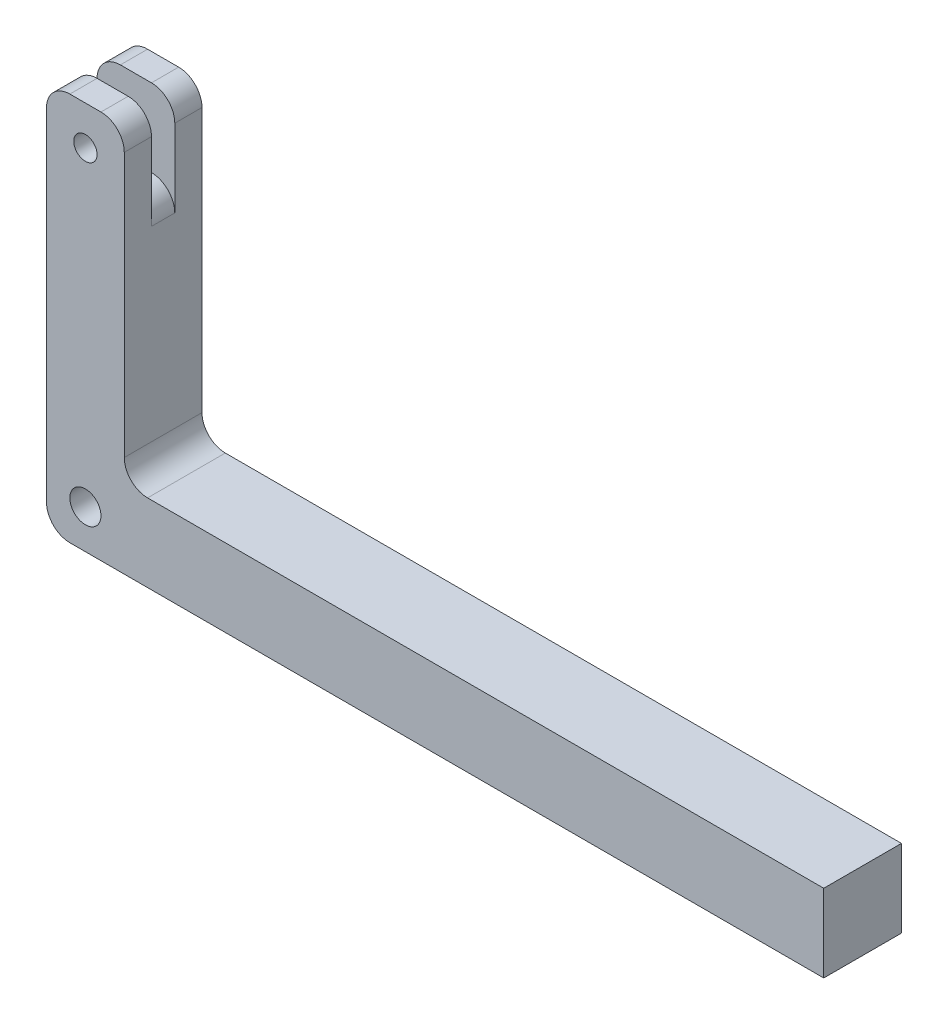
ISO-10303-21;
HEADER;
FILE_DESCRIPTION(('STEP AP214'),'2;1');
FILE_NAME('part.step','',(''),(''),'','','');
FILE_SCHEMA(('AUTOMOTIVE_DESIGN { 1 0 10303 214 1 1 1 1 }'));
ENDSEC;
DATA;
#1=APPLICATION_CONTEXT('core data for automotive mechanical design processes');
#2=APPLICATION_PROTOCOL_DEFINITION('international standard','automotive_design',2000,#1);
#3=PRODUCT_CONTEXT('',#1,'mechanical');
#4=PRODUCT('Part','Part','',(#3));
#5=PRODUCT_RELATED_PRODUCT_CATEGORY('part','',(#4));
#6=PRODUCT_DEFINITION_FORMATION('','',#4);
#7=PRODUCT_DEFINITION_CONTEXT('part definition',#1,'design');
#8=PRODUCT_DEFINITION('design','',#6,#7);
#9=PRODUCT_DEFINITION_SHAPE('','',#8);
#10=(LENGTH_UNIT() NAMED_UNIT(*) SI_UNIT(.MILLI.,.METRE.));
#11=(NAMED_UNIT(*) PLANE_ANGLE_UNIT() SI_UNIT($,.RADIAN.));
#12=(NAMED_UNIT(*) SI_UNIT($,.STERADIAN.) SOLID_ANGLE_UNIT());
#13=UNCERTAINTY_MEASURE_WITH_UNIT(LENGTH_MEASURE(1.E-05),#10,'distance_accuracy_value','');
#14=(GEOMETRIC_REPRESENTATION_CONTEXT(3) GLOBAL_UNCERTAINTY_ASSIGNED_CONTEXT((#13)) GLOBAL_UNIT_ASSIGNED_CONTEXT((#10,
#11,#12)) REPRESENTATION_CONTEXT('',''));
#15=CARTESIAN_POINT('',(0.,0.,0.));
#16=DIRECTION('',(0.,0.,1.));
#17=DIRECTION('',(1.,0.,0.));
#18=AXIS2_PLACEMENT_3D('',#15,#16,#17);
#19=CARTESIAN_POINT('',(0.,0.,0.));
#20=DIRECTION('',(0.,0.,1.));
#21=DIRECTION('',(1.,0.,0.));
#22=AXIS2_PLACEMENT_3D('',#19,#20,#21);
#23=PLANE('',#22);
#24=DIRECTION('',(1.,0.,0.));
#25=VECTOR('',#24,1.);
#26=CARTESIAN_POINT('',(0.,0.,0.));
#27=LINE('',#26,#25);
#28=CARTESIAN_POINT('',(3.,0.,0.));
#29=VERTEX_POINT('',#28);
#30=CARTESIAN_POINT('',(100.,0.,0.));
#31=VERTEX_POINT('',#30);
#32=EDGE_CURVE('E178',#29,#31,#27,.T.);
#33=ORIENTED_EDGE('',*,*,#32,.F.);
#34=CARTESIAN_POINT('',(3.,3.,0.));
#35=DIRECTION('',(0.,0.,1.));
#36=DIRECTION('',(1.,0.,0.));
#37=AXIS2_PLACEMENT_3D('',#34,#35,#36);
#38=CIRCLE('',#37,3.);
#39=CARTESIAN_POINT('',(0.,3.,0.));
#40=VERTEX_POINT('',#39);
#41=EDGE_CURVE('E232',#29,#40,#38,.F.);
#42=ORIENTED_EDGE('',*,*,#41,.T.);
#43=DIRECTION('',(0.,-1.,0.));
#44=VECTOR('',#43,1.);
#45=CARTESIAN_POINT('',(0.,50.,0.));
#46=LINE('',#45,#44);
#47=CARTESIAN_POINT('',(0.,47.,0.));
#48=VERTEX_POINT('',#47);
#49=EDGE_CURVE('E198',#48,#40,#46,.T.);
#50=ORIENTED_EDGE('',*,*,#49,.F.);
#51=CARTESIAN_POINT('',(3.,47.,0.));
#52=DIRECTION('',(0.,0.,1.));
#53=DIRECTION('',(1.,0.,0.));
#54=AXIS2_PLACEMENT_3D('',#51,#52,#53);
#55=CIRCLE('',#54,3.);
#56=CARTESIAN_POINT('',(3.,50.,0.));
#57=VERTEX_POINT('',#56);
#58=EDGE_CURVE('E228',#48,#57,#55,.F.);
#59=ORIENTED_EDGE('',*,*,#58,.T.);
#60=DIRECTION('',(-1.,0.,0.));
#61=VECTOR('',#60,1.);
#62=CARTESIAN_POINT('',(10.,50.,0.));
#63=LINE('',#62,#61);
#64=CARTESIAN_POINT('',(7.,50.,0.));
#65=VERTEX_POINT('',#64);
#66=EDGE_CURVE('E211',#65,#57,#63,.T.);
#67=ORIENTED_EDGE('',*,*,#66,.F.);
#68=CARTESIAN_POINT('',(7.,47.,0.));
#69=DIRECTION('',(0.,0.,1.));
#70=DIRECTION('',(1.,0.,0.));
#71=AXIS2_PLACEMENT_3D('',#68,#69,#70);
#72=CIRCLE('',#71,3.);
#73=CARTESIAN_POINT('',(10.,47.,0.));
#74=VERTEX_POINT('',#73);
#75=EDGE_CURVE('E230',#65,#74,#72,.F.);
#76=ORIENTED_EDGE('',*,*,#75,.T.);
#77=DIRECTION('',(0.,1.,0.));
#78=VECTOR('',#77,1.);
#79=CARTESIAN_POINT('',(9.99999999999999,9.99999999999999,0.));
#80=LINE('',#79,#78);
#81=CARTESIAN_POINT('',(9.99999999999999,13.,0.));
#82=VERTEX_POINT('',#81);
#83=EDGE_CURVE('E208',#82,#74,#80,.T.);
#84=ORIENTED_EDGE('',*,*,#83,.F.);
#85=CARTESIAN_POINT('',(13.,13.,0.));
#86=DIRECTION('',(0.,0.,1.));
#87=DIRECTION('',(1.,0.,0.));
#88=AXIS2_PLACEMENT_3D('',#85,#86,#87);
#89=CIRCLE('',#88,3.);
#90=CARTESIAN_POINT('',(13.,9.99999999999999,0.));
#91=VERTEX_POINT('',#90);
#92=EDGE_CURVE('E271',#82,#91,#89,.T.);
#93=ORIENTED_EDGE('',*,*,#92,.T.);
#94=DIRECTION('',(-1.,0.,0.));
#95=VECTOR('',#94,1.);
#96=CARTESIAN_POINT('',(100.,10.,0.));
#97=LINE('',#96,#95);
#98=CARTESIAN_POINT('',(100.,10.,0.));
#99=VERTEX_POINT('',#98);
#100=EDGE_CURVE('E205',#99,#91,#97,.T.);
#101=ORIENTED_EDGE('',*,*,#100,.F.);
#102=DIRECTION('',(0.,1.,0.));
#103=VECTOR('',#102,1.);
#104=CARTESIAN_POINT('',(100.,0.,0.));
#105=LINE('',#104,#103);
#106=EDGE_CURVE('E203',#31,#99,#105,.T.);
#107=ORIENTED_EDGE('',*,*,#106,.F.);
#108=EDGE_LOOP('',(#33,#42,#50,#59,#67,#76,#84,#93,#101,#107));
#109=FACE_BOUND('',#108,.T.);
#110=CARTESIAN_POINT('',(5.,5.,0.));
#111=DIRECTION('',(0.,0.,1.));
#112=DIRECTION('',(1.,0.,0.));
#113=AXIS2_PLACEMENT_3D('',#110,#111,#112);
#114=CIRCLE('',#113,2.);
#115=CARTESIAN_POINT('',(7.,5.,0.));
#116=VERTEX_POINT('',#115);
#117=EDGE_CURVE('E309',#116,#116,#114,.T.);
#118=ORIENTED_EDGE('',*,*,#117,.T.);
#119=EDGE_LOOP('',(#118));
#120=FACE_BOUND('',#119,.T.);
#121=CARTESIAN_POINT('',(5.,45.,0.));
#122=DIRECTION('',(0.,0.,-1.));
#123=DIRECTION('',(-1.,0.,0.));
#124=AXIS2_PLACEMENT_3D('',#121,#122,#123);
#125=CIRCLE('',#124,1.5);
#126=CARTESIAN_POINT('',(3.5,45.,0.));
#127=VERTEX_POINT('',#126);
#128=EDGE_CURVE('E562',#127,#127,#125,.T.);
#129=ORIENTED_EDGE('',*,*,#128,.F.);
#130=EDGE_LOOP('',(#129));
#131=FACE_BOUND('',#130,.T.);
#132=ADVANCED_FACE('F33',(#109,#120,#131),#23,.F.);
#133=CARTESIAN_POINT('',(10.,50.,10.));
#134=DIRECTION('',(0.,-1.,0.));
#135=DIRECTION('',(0.,0.,-1.));
#136=AXIS2_PLACEMENT_3D('',#133,#134,#135);
#137=PLANE('',#136);
#138=DIRECTION('',(-1.,0.,0.));
#139=VECTOR('',#138,1.);
#140=CARTESIAN_POINT('',(0.,50.,3.5));
#141=LINE('',#140,#139);
#142=CARTESIAN_POINT('',(7.,50.,3.5));
#143=VERTEX_POINT('',#142);
#144=CARTESIAN_POINT('',(3.,50.,3.5));
#145=VERTEX_POINT('',#144);
#146=EDGE_CURVE('E341',#143,#145,#141,.T.);
#147=ORIENTED_EDGE('',*,*,#146,.F.);
#148=DIRECTION('',(0.,0.,-1.));
#149=VECTOR('',#148,1.);
#150=CARTESIAN_POINT('',(7.,50.,10.));
#151=LINE('',#150,#149);
#152=EDGE_CURVE('E258',#143,#65,#151,.T.);
#153=ORIENTED_EDGE('',*,*,#152,.T.);
#154=ORIENTED_EDGE('',*,*,#66,.T.);
#155=DIRECTION('',(0.,0.,-1.));
#156=VECTOR('',#155,1.);
#157=CARTESIAN_POINT('',(3.,50.,10.));
#158=LINE('',#157,#156);
#159=EDGE_CURVE('E256',#57,#145,#158,.F.);
#160=ORIENTED_EDGE('',*,*,#159,.T.);
#161=EDGE_LOOP('',(#147,#153,#154,#160));
#162=FACE_BOUND('',#161,.T.);
#163=ADVANCED_FACE('F338',(#162),#137,.F.);
#164=CARTESIAN_POINT('',(0.,0.,10.));
#165=DIRECTION('',(0.,0.,1.));
#166=DIRECTION('',(1.,0.,0.));
#167=AXIS2_PLACEMENT_3D('',#164,#165,#166);
#168=PLANE('',#167);
#169=CARTESIAN_POINT('',(5.,45.,10.));
#170=DIRECTION('',(0.,0.,1.));
#171=DIRECTION('',(1.,0.,0.));
#172=AXIS2_PLACEMENT_3D('',#169,#170,#171);
#173=CIRCLE('',#172,1.5);
#174=CARTESIAN_POINT('',(6.5,45.,10.));
#175=VERTEX_POINT('',#174);
#176=EDGE_CURVE('E560',#175,#175,#173,.F.);
#177=ORIENTED_EDGE('',*,*,#176,.T.);
#178=EDGE_LOOP('',(#177));
#179=FACE_BOUND('',#178,.T.);
#180=DIRECTION('',(0.,-1.,0.));
#181=VECTOR('',#180,1.);
#182=CARTESIAN_POINT('',(0.,50.,10.));
#183=LINE('',#182,#181);
#184=CARTESIAN_POINT('',(0.,47.,10.));
#185=VERTEX_POINT('',#184);
#186=CARTESIAN_POINT('',(0.,3.,10.));
#187=VERTEX_POINT('',#186);
#188=EDGE_CURVE('E172',#185,#187,#183,.T.);
#189=ORIENTED_EDGE('',*,*,#188,.T.);
#190=CARTESIAN_POINT('',(3.,3.,10.));
#191=DIRECTION('',(0.,0.,1.));
#192=DIRECTION('',(1.,0.,0.));
#193=AXIS2_PLACEMENT_3D('',#190,#191,#192);
#194=CIRCLE('',#193,3.);
#195=CARTESIAN_POINT('',(3.,0.,10.));
#196=VERTEX_POINT('',#195);
#197=EDGE_CURVE('E168',#187,#196,#194,.T.);
#198=ORIENTED_EDGE('',*,*,#197,.T.);
#199=DIRECTION('',(1.,0.,0.));
#200=VECTOR('',#199,1.);
#201=CARTESIAN_POINT('',(0.,0.,10.));
#202=LINE('',#201,#200);
#203=CARTESIAN_POINT('',(100.,0.,10.));
#204=VERTEX_POINT('',#203);
#205=EDGE_CURVE('E158',#196,#204,#202,.T.);
#206=ORIENTED_EDGE('',*,*,#205,.T.);
#207=DIRECTION('',(0.,1.,0.));
#208=VECTOR('',#207,1.);
#209=CARTESIAN_POINT('',(100.,0.,10.));
#210=LINE('',#209,#208);
#211=CARTESIAN_POINT('',(100.,10.,10.));
#212=VERTEX_POINT('',#211);
#213=EDGE_CURVE('E165',#204,#212,#210,.T.);
#214=ORIENTED_EDGE('',*,*,#213,.T.);
#215=DIRECTION('',(-1.,0.,0.));
#216=VECTOR('',#215,1.);
#217=CARTESIAN_POINT('',(100.,10.,10.));
#218=LINE('',#217,#216);
#219=CARTESIAN_POINT('',(13.,9.99999999999999,10.));
#220=VERTEX_POINT('',#219);
#221=EDGE_CURVE('E187',#212,#220,#218,.T.);
#222=ORIENTED_EDGE('',*,*,#221,.T.);
#223=CARTESIAN_POINT('',(13.,13.,10.));
#224=DIRECTION('',(0.,0.,1.));
#225=DIRECTION('',(1.,0.,0.));
#226=AXIS2_PLACEMENT_3D('',#223,#224,#225);
#227=CIRCLE('',#226,3.);
#228=CARTESIAN_POINT('',(9.99999999999999,13.,10.));
#229=VERTEX_POINT('',#228);
#230=EDGE_CURVE('E273',#220,#229,#227,.F.);
#231=ORIENTED_EDGE('',*,*,#230,.T.);
#232=DIRECTION('',(0.,1.,0.));
#233=VECTOR('',#232,1.);
#234=CARTESIAN_POINT('',(9.99999999999999,9.99999999999999,10.));
#235=LINE('',#234,#233);
#236=CARTESIAN_POINT('',(10.,47.,10.));
#237=VERTEX_POINT('',#236);
#238=EDGE_CURVE('E189',#229,#237,#235,.T.);
#239=ORIENTED_EDGE('',*,*,#238,.T.);
#240=CARTESIAN_POINT('',(7.,47.,10.));
#241=DIRECTION('',(0.,0.,1.));
#242=DIRECTION('',(1.,0.,0.));
#243=AXIS2_PLACEMENT_3D('',#240,#241,#242);
#244=CIRCLE('',#243,3.);
#245=CARTESIAN_POINT('',(7.,50.,10.));
#246=VERTEX_POINT('',#245);
#247=EDGE_CURVE('E247',#237,#246,#244,.T.);
#248=ORIENTED_EDGE('',*,*,#247,.T.);
#249=DIRECTION('',(-1.,0.,0.));
#250=VECTOR('',#249,1.);
#251=CARTESIAN_POINT('',(10.,50.,10.));
#252=LINE('',#251,#250);
#253=CARTESIAN_POINT('',(3.,50.,10.));
#254=VERTEX_POINT('',#253);
#255=EDGE_CURVE('E195',#246,#254,#252,.T.);
#256=ORIENTED_EDGE('',*,*,#255,.T.);
#257=CARTESIAN_POINT('',(3.,47.,10.));
#258=DIRECTION('',(0.,0.,1.));
#259=DIRECTION('',(1.,0.,0.));
#260=AXIS2_PLACEMENT_3D('',#257,#258,#259);
#261=CIRCLE('',#260,3.);
#262=EDGE_CURVE('E245',#254,#185,#261,.T.);
#263=ORIENTED_EDGE('',*,*,#262,.T.);
#264=EDGE_LOOP('',(#189,#198,#206,#214,#222,#231,#239,#248,#256,#263));
#265=FACE_BOUND('',#264,.T.);
#266=CARTESIAN_POINT('',(5.,5.,10.));
#267=DIRECTION('',(0.,0.,1.));
#268=DIRECTION('',(1.,0.,0.));
#269=AXIS2_PLACEMENT_3D('',#266,#267,#268);
#270=CIRCLE('',#269,2.);
#271=CARTESIAN_POINT('',(7.,5.,10.));
#272=VERTEX_POINT('',#271);
#273=EDGE_CURVE('E201',#272,#272,#270,.T.);
#274=ORIENTED_EDGE('',*,*,#273,.F.);
#275=EDGE_LOOP('',(#274));
#276=FACE_BOUND('',#275,.T.);
#277=ADVANCED_FACE('F161',(#179,#265,#276),#168,.T.);
#278=CARTESIAN_POINT('',(0.,50.,10.));
#279=DIRECTION('',(1.,0.,0.));
#280=DIRECTION('',(0.,0.,-1.));
#281=AXIS2_PLACEMENT_3D('',#278,#279,#280);
#282=PLANE('',#281);
#283=ORIENTED_EDGE('',*,*,#49,.T.);
#284=DIRECTION('',(0.,0.,-1.));
#285=VECTOR('',#284,1.);
#286=CARTESIAN_POINT('',(0.,3.,10.));
#287=LINE('',#286,#285);
#288=EDGE_CURVE('E243',#40,#187,#287,.F.);
#289=ORIENTED_EDGE('',*,*,#288,.T.);
#290=ORIENTED_EDGE('',*,*,#188,.F.);
#291=DIRECTION('',(0.,0.,-1.));
#292=VECTOR('',#291,1.);
#293=CARTESIAN_POINT('',(0.,47.,10.));
#294=LINE('',#293,#292);
#295=CARTESIAN_POINT('',(0.,47.,6.5));
#296=VERTEX_POINT('',#295);
#297=EDGE_CURVE('E240',#185,#296,#294,.T.);
#298=ORIENTED_EDGE('',*,*,#297,.T.);
#299=DIRECTION('',(0.,1.,0.));
#300=VECTOR('',#299,1.);
#301=CARTESIAN_POINT('',(0.,40.,6.5));
#302=LINE('',#301,#300);
#303=CARTESIAN_POINT('',(0.,37.,6.5));
#304=VERTEX_POINT('',#303);
#305=EDGE_CURVE('E283',#304,#296,#302,.T.);
#306=ORIENTED_EDGE('',*,*,#305,.F.);
#307=DIRECTION('',(0.,0.,1.));
#308=VECTOR('',#307,1.);
#309=CARTESIAN_POINT('',(0.,37.,10.));
#310=LINE('',#309,#308);
#311=CARTESIAN_POINT('',(0.,37.,3.5));
#312=VERTEX_POINT('',#311);
#313=EDGE_CURVE('E237',#304,#312,#310,.F.);
#314=ORIENTED_EDGE('',*,*,#313,.T.);
#315=DIRECTION('',(0.,1.,0.));
#316=VECTOR('',#315,1.);
#317=CARTESIAN_POINT('',(0.,40.,3.5));
#318=LINE('',#317,#316);
#319=CARTESIAN_POINT('',(0.,47.,3.5));
#320=VERTEX_POINT('',#319);
#321=EDGE_CURVE('E293',#312,#320,#318,.T.);
#322=ORIENTED_EDGE('',*,*,#321,.T.);
#323=DIRECTION('',(0.,0.,-1.));
#324=VECTOR('',#323,1.);
#325=CARTESIAN_POINT('',(0.,47.,10.));
#326=LINE('',#325,#324);
#327=EDGE_CURVE('E234',#320,#48,#326,.T.);
#328=ORIENTED_EDGE('',*,*,#327,.T.);
#329=EDGE_LOOP('',(#283,#289,#290,#298,#306,#314,#322,#328));
#330=FACE_BOUND('',#329,.T.);
#331=ADVANCED_FACE('F292',(#330),#282,.F.);
#332=CARTESIAN_POINT('',(0.,0.,10.));
#333=DIRECTION('',(0.,1.,0.));
#334=DIRECTION('',(0.,0.,1.));
#335=AXIS2_PLACEMENT_3D('',#332,#333,#334);
#336=PLANE('',#335);
#337=ORIENTED_EDGE('',*,*,#205,.F.);
#338=DIRECTION('',(0.,0.,-1.));
#339=VECTOR('',#338,1.);
#340=CARTESIAN_POINT('',(3.,0.,10.));
#341=LINE('',#340,#339);
#342=EDGE_CURVE('E226',#196,#29,#341,.T.);
#343=ORIENTED_EDGE('',*,*,#342,.T.);
#344=ORIENTED_EDGE('',*,*,#32,.T.);
#345=DIRECTION('',(0.,0.,-1.));
#346=VECTOR('',#345,1.);
#347=CARTESIAN_POINT('',(100.,0.,10.));
#348=LINE('',#347,#346);
#349=EDGE_CURVE('E175',#204,#31,#348,.T.);
#350=ORIENTED_EDGE('',*,*,#349,.F.);
#351=EDGE_LOOP('',(#337,#343,#344,#350));
#352=FACE_BOUND('',#351,.T.);
#353=ADVANCED_FACE('F176',(#352),#336,.F.);
#354=CARTESIAN_POINT('',(100.,0.,10.));
#355=DIRECTION('',(-1.,0.,0.));
#356=DIRECTION('',(0.,0.,1.));
#357=AXIS2_PLACEMENT_3D('',#354,#355,#356);
#358=PLANE('',#357);
#359=ORIENTED_EDGE('',*,*,#106,.T.);
#360=DIRECTION('',(0.,0.,-1.));
#361=VECTOR('',#360,1.);
#362=CARTESIAN_POINT('',(100.,10.,10.));
#363=LINE('',#362,#361);
#364=EDGE_CURVE('E182',#212,#99,#363,.T.);
#365=ORIENTED_EDGE('',*,*,#364,.F.);
#366=ORIENTED_EDGE('',*,*,#213,.F.);
#367=ORIENTED_EDGE('',*,*,#349,.T.);
#368=EDGE_LOOP('',(#359,#365,#366,#367));
#369=FACE_BOUND('',#368,.T.);
#370=ADVANCED_FACE('F184',(#369),#358,.F.);
#371=CARTESIAN_POINT('',(100.,10.,10.));
#372=DIRECTION('',(0.,-1.,0.));
#373=DIRECTION('',(1.,0.,0.));
#374=AXIS2_PLACEMENT_3D('',#371,#372,#373);
#375=PLANE('',#374);
#376=ORIENTED_EDGE('',*,*,#100,.T.);
#377=DIRECTION('',(0.,0.,-1.));
#378=VECTOR('',#377,1.);
#379=CARTESIAN_POINT('',(13.,9.99999999999999,10.));
#380=LINE('',#379,#378);
#381=EDGE_CURVE('E224',#91,#220,#380,.F.);
#382=ORIENTED_EDGE('',*,*,#381,.T.);
#383=ORIENTED_EDGE('',*,*,#221,.F.);
#384=ORIENTED_EDGE('',*,*,#364,.T.);
#385=EDGE_LOOP('',(#376,#382,#383,#384));
#386=FACE_BOUND('',#385,.T.);
#387=ADVANCED_FACE('F320',(#386),#375,.F.);
#388=CARTESIAN_POINT('',(9.99999999999999,9.99999999999999,10.));
#389=DIRECTION('',(-1.,0.,0.));
#390=DIRECTION('',(0.,-1.,0.));
#391=AXIS2_PLACEMENT_3D('',#388,#389,#390);
#392=PLANE('',#391);
#393=ORIENTED_EDGE('',*,*,#238,.F.);
#394=DIRECTION('',(0.,0.,-1.));
#395=VECTOR('',#394,1.);
#396=CARTESIAN_POINT('',(9.99999999999999,13.,0.));
#397=LINE('',#396,#395);
#398=EDGE_CURVE('E221',#229,#82,#397,.T.);
#399=ORIENTED_EDGE('',*,*,#398,.T.);
#400=ORIENTED_EDGE('',*,*,#83,.T.);
#401=DIRECTION('',(0.,0.,-1.));
#402=VECTOR('',#401,1.);
#403=CARTESIAN_POINT('',(10.,47.,10.));
#404=LINE('',#403,#402);
#405=CARTESIAN_POINT('',(9.99999999999999,47.,3.5));
#406=VERTEX_POINT('',#405);
#407=EDGE_CURVE('E216',#74,#406,#404,.F.);
#408=ORIENTED_EDGE('',*,*,#407,.T.);
#409=DIRECTION('',(0.,1.,0.));
#410=VECTOR('',#409,1.);
#411=CARTESIAN_POINT('',(9.99999999999999,40.,3.5));
#412=LINE('',#411,#410);
#413=CARTESIAN_POINT('',(10.,37.,3.5));
#414=VERTEX_POINT('',#413);
#415=EDGE_CURVE('E301',#414,#406,#412,.T.);
#416=ORIENTED_EDGE('',*,*,#415,.F.);
#417=DIRECTION('',(0.,0.,-1.));
#418=VECTOR('',#417,1.);
#419=CARTESIAN_POINT('',(10.,37.,10.));
#420=LINE('',#419,#418);
#421=CARTESIAN_POINT('',(9.99999999999999,37.,6.5));
#422=VERTEX_POINT('',#421);
#423=EDGE_CURVE('E218',#414,#422,#420,.F.);
#424=ORIENTED_EDGE('',*,*,#423,.T.);
#425=DIRECTION('',(0.,1.,0.));
#426=VECTOR('',#425,1.);
#427=CARTESIAN_POINT('',(9.99999999999999,40.,6.5));
#428=LINE('',#427,#426);
#429=CARTESIAN_POINT('',(9.99999999999999,47.,6.5));
#430=VERTEX_POINT('',#429);
#431=EDGE_CURVE('E297',#422,#430,#428,.T.);
#432=ORIENTED_EDGE('',*,*,#431,.T.);
#433=DIRECTION('',(0.,0.,-1.));
#434=VECTOR('',#433,1.);
#435=CARTESIAN_POINT('',(10.,47.,10.));
#436=LINE('',#435,#434);
#437=EDGE_CURVE('E181',#430,#237,#436,.F.);
#438=ORIENTED_EDGE('',*,*,#437,.T.);
#439=EDGE_LOOP('',(#393,#399,#400,#408,#416,#424,#432,#438));
#440=FACE_BOUND('',#439,.T.);
#441=ADVANCED_FACE('F329',(#440),#392,.F.);
#442=ORIENTED_EDGE('',*,*,#255,.F.);
#443=DIRECTION('',(0.,0.,-1.));
#444=VECTOR('',#443,1.);
#445=CARTESIAN_POINT('',(7.,50.,10.));
#446=LINE('',#445,#444);
#447=CARTESIAN_POINT('',(7.,50.,6.5));
#448=VERTEX_POINT('',#447);
#449=EDGE_CURVE('E267',#246,#448,#446,.T.);
#450=ORIENTED_EDGE('',*,*,#449,.T.);
#451=DIRECTION('',(1.,0.,0.));
#452=VECTOR('',#451,1.);
#453=CARTESIAN_POINT('',(0.,50.,6.5));
#454=LINE('',#453,#452);
#455=CARTESIAN_POINT('',(3.,50.,6.5));
#456=VERTEX_POINT('',#455);
#457=EDGE_CURVE('E344',#456,#448,#454,.T.);
#458=ORIENTED_EDGE('',*,*,#457,.F.);
#459=DIRECTION('',(0.,0.,-1.));
#460=VECTOR('',#459,1.);
#461=CARTESIAN_POINT('',(3.,50.,10.));
#462=LINE('',#461,#460);
#463=EDGE_CURVE('E265',#456,#254,#462,.F.);
#464=ORIENTED_EDGE('',*,*,#463,.T.);
#465=EDGE_LOOP('',(#442,#450,#458,#464));
#466=FACE_BOUND('',#465,.T.);
#467=ADVANCED_FACE('F372',(#466),#137,.F.);
#468=CARTESIAN_POINT('',(5.,5.,10.));
#469=DIRECTION('',(0.,0.,-1.));
#470=DIRECTION('',(-1.,0.,0.));
#471=AXIS2_PLACEMENT_3D('',#468,#469,#470);
#472=CYLINDRICAL_SURFACE('',#471,2.);
#473=ORIENTED_EDGE('',*,*,#273,.T.);
#474=EDGE_LOOP('',(#473));
#475=FACE_BOUND('',#474,.T.);
#476=ORIENTED_EDGE('',*,*,#117,.F.);
#477=EDGE_LOOP('',(#476));
#478=FACE_BOUND('',#477,.T.);
#479=ADVANCED_FACE('F377',(#475,#478),#472,.F.);
#480=CARTESIAN_POINT('',(0.,40.,3.5));
#481=DIRECTION('',(0.,0.,-1.));
#482=DIRECTION('',(-1.,0.,0.));
#483=AXIS2_PLACEMENT_3D('',#480,#481,#482);
#484=PLANE('',#483);
#485=CARTESIAN_POINT('',(5.,45.,3.5));
#486=DIRECTION('',(0.,0.,-1.));
#487=DIRECTION('',(-1.,0.,0.));
#488=AXIS2_PLACEMENT_3D('',#485,#486,#487);
#489=CIRCLE('',#488,1.5);
#490=CARTESIAN_POINT('',(3.5,45.,3.5));
#491=VERTEX_POINT('',#490);
#492=EDGE_CURVE('E347',#491,#491,#489,.T.);
#493=ORIENTED_EDGE('',*,*,#492,.T.);
#494=EDGE_LOOP('',(#493));
#495=FACE_BOUND('',#494,.T.);
#496=ORIENTED_EDGE('',*,*,#415,.T.);
#497=CARTESIAN_POINT('',(7.,47.,3.5));
#498=DIRECTION('',(0.,0.,-1.));
#499=DIRECTION('',(-1.,0.,0.));
#500=AXIS2_PLACEMENT_3D('',#497,#498,#499);
#501=CIRCLE('',#500,3.);
#502=EDGE_CURVE('E263',#406,#143,#501,.F.);
#503=ORIENTED_EDGE('',*,*,#502,.T.);
#504=ORIENTED_EDGE('',*,*,#146,.T.);
#505=CARTESIAN_POINT('',(3.,47.,3.5));
#506=DIRECTION('',(0.,0.,-1.));
#507=DIRECTION('',(-1.,0.,0.));
#508=AXIS2_PLACEMENT_3D('',#505,#506,#507);
#509=CIRCLE('',#508,3.);
#510=EDGE_CURVE('E261',#145,#320,#509,.F.);
#511=ORIENTED_EDGE('',*,*,#510,.T.);
#512=ORIENTED_EDGE('',*,*,#321,.F.);
#513=CARTESIAN_POINT('',(3.,37.,3.5));
#514=DIRECTION('',(0.,0.,-1.));
#515=DIRECTION('',(-1.,0.,0.));
#516=AXIS2_PLACEMENT_3D('',#513,#514,#515);
#517=CIRCLE('',#516,3.);
#518=CARTESIAN_POINT('',(3.,40.,3.5));
#519=VERTEX_POINT('',#518);
#520=EDGE_CURVE('E11',#312,#519,#517,.T.);
#521=ORIENTED_EDGE('',*,*,#520,.T.);
#522=DIRECTION('',(-1.,0.,0.));
#523=VECTOR('',#522,1.);
#524=CARTESIAN_POINT('',(0.,40.,3.5));
#525=LINE('',#524,#523);
#526=CARTESIAN_POINT('',(7.,40.,3.5));
#527=VERTEX_POINT('',#526);
#528=EDGE_CURVE('E298',#527,#519,#525,.T.);
#529=ORIENTED_EDGE('',*,*,#528,.F.);
#530=CARTESIAN_POINT('',(7.,37.,3.5));
#531=DIRECTION('',(0.,0.,-1.));
#532=DIRECTION('',(-1.,0.,0.));
#533=AXIS2_PLACEMENT_3D('',#530,#531,#532);
#534=CIRCLE('',#533,3.);
#535=EDGE_CURVE('E275',#527,#414,#534,.T.);
#536=ORIENTED_EDGE('',*,*,#535,.T.);
#537=EDGE_LOOP('',(#496,#503,#504,#511,#512,#521,#529,#536));
#538=FACE_BOUND('',#537,.T.);
#539=ADVANCED_FACE('F351',(#495,#538),#484,.F.);
#540=CARTESIAN_POINT('',(0.,40.,6.5));
#541=DIRECTION('',(0.,0.,1.));
#542=DIRECTION('',(1.,0.,0.));
#543=AXIS2_PLACEMENT_3D('',#540,#541,#542);
#544=PLANE('',#543);
#545=CARTESIAN_POINT('',(5.,45.,6.5));
#546=DIRECTION('',(0.,0.,1.));
#547=DIRECTION('',(1.,0.,0.));
#548=AXIS2_PLACEMENT_3D('',#545,#546,#547);
#549=CIRCLE('',#548,1.5);
#550=CARTESIAN_POINT('',(6.5,45.,6.5));
#551=VERTEX_POINT('',#550);
#552=EDGE_CURVE('E561',#551,#551,#549,.T.);
#553=ORIENTED_EDGE('',*,*,#552,.T.);
#554=EDGE_LOOP('',(#553));
#555=FACE_BOUND('',#554,.T.);
#556=ORIENTED_EDGE('',*,*,#457,.T.);
#557=CARTESIAN_POINT('',(7.,47.,6.5));
#558=DIRECTION('',(0.,0.,1.));
#559=DIRECTION('',(1.,0.,0.));
#560=AXIS2_PLACEMENT_3D('',#557,#558,#559);
#561=CIRCLE('',#560,3.);
#562=EDGE_CURVE('E48',#448,#430,#561,.F.);
#563=ORIENTED_EDGE('',*,*,#562,.T.);
#564=ORIENTED_EDGE('',*,*,#431,.F.);
#565=CARTESIAN_POINT('',(7.,37.,6.5));
#566=DIRECTION('',(0.,0.,1.));
#567=DIRECTION('',(1.,0.,0.));
#568=AXIS2_PLACEMENT_3D('',#565,#566,#567);
#569=CIRCLE('',#568,3.);
#570=CARTESIAN_POINT('',(7.,40.,6.5));
#571=VERTEX_POINT('',#570);
#572=EDGE_CURVE('E278',#422,#571,#569,.T.);
#573=ORIENTED_EDGE('',*,*,#572,.T.);
#574=DIRECTION('',(1.,0.,0.));
#575=VECTOR('',#574,1.);
#576=CARTESIAN_POINT('',(0.,40.,6.5));
#577=LINE('',#576,#575);
#578=CARTESIAN_POINT('',(3.,40.,6.5));
#579=VERTEX_POINT('',#578);
#580=EDGE_CURVE('E285',#579,#571,#577,.T.);
#581=ORIENTED_EDGE('',*,*,#580,.F.);
#582=CARTESIAN_POINT('',(3.,37.,6.5));
#583=DIRECTION('',(0.,0.,1.));
#584=DIRECTION('',(1.,0.,0.));
#585=AXIS2_PLACEMENT_3D('',#582,#583,#584);
#586=CIRCLE('',#585,3.);
#587=EDGE_CURVE('E41',#579,#304,#586,.T.);
#588=ORIENTED_EDGE('',*,*,#587,.T.);
#589=ORIENTED_EDGE('',*,*,#305,.T.);
#590=CARTESIAN_POINT('',(3.,47.,6.5));
#591=DIRECTION('',(0.,0.,1.));
#592=DIRECTION('',(1.,0.,0.));
#593=AXIS2_PLACEMENT_3D('',#590,#591,#592);
#594=CIRCLE('',#593,3.);
#595=EDGE_CURVE('E56',#296,#456,#594,.F.);
#596=ORIENTED_EDGE('',*,*,#595,.T.);
#597=EDGE_LOOP('',(#556,#563,#564,#573,#581,#588,#589,#596));
#598=FACE_BOUND('',#597,.T.);
#599=ADVANCED_FACE('F282',(#555,#598),#544,.F.);
#600=CARTESIAN_POINT('',(0.,40.,0.));
#601=DIRECTION('',(0.,-1.,0.));
#602=DIRECTION('',(0.,0.,-1.));
#603=AXIS2_PLACEMENT_3D('',#600,#601,#602);
#604=PLANE('',#603);
#605=ORIENTED_EDGE('',*,*,#580,.T.);
#606=DIRECTION('',(0.,0.,-1.));
#607=VECTOR('',#606,1.);
#608=CARTESIAN_POINT('',(7.,40.,0.));
#609=LINE('',#608,#607);
#610=EDGE_CURVE('E253',#571,#527,#609,.T.);
#611=ORIENTED_EDGE('',*,*,#610,.T.);
#612=ORIENTED_EDGE('',*,*,#528,.T.);
#613=DIRECTION('',(0.,0.,1.));
#614=VECTOR('',#613,1.);
#615=CARTESIAN_POINT('',(3.,40.,0.));
#616=LINE('',#615,#614);
#617=EDGE_CURVE('E250',#519,#579,#616,.T.);
#618=ORIENTED_EDGE('',*,*,#617,.T.);
#619=EDGE_LOOP('',(#605,#611,#612,#618));
#620=FACE_BOUND('',#619,.T.);
#621=ADVANCED_FACE('F359',(#620),#604,.F.);
#622=CARTESIAN_POINT('',(5.,45.,0.));
#623=DIRECTION('',(0.,0.,-1.));
#624=DIRECTION('',(-1.,0.,0.));
#625=AXIS2_PLACEMENT_3D('',#622,#623,#624);
#626=CYLINDRICAL_SURFACE('',#625,1.5);
#627=ORIENTED_EDGE('',*,*,#128,.T.);
#628=EDGE_LOOP('',(#627));
#629=FACE_BOUND('',#628,.T.);
#630=ORIENTED_EDGE('',*,*,#492,.F.);
#631=EDGE_LOOP('',(#630));
#632=FACE_BOUND('',#631,.T.);
#633=ADVANCED_FACE('F455',(#629,#632),#626,.F.);
#634=ORIENTED_EDGE('',*,*,#176,.F.);
#635=EDGE_LOOP('',(#634));
#636=FACE_BOUND('',#635,.T.);
#637=ORIENTED_EDGE('',*,*,#552,.F.);
#638=EDGE_LOOP('',(#637));
#639=FACE_BOUND('',#638,.T.);
#640=ADVANCED_FACE('F391',(#636,#639),#626,.F.);
#641=CARTESIAN_POINT('',(13.,13.,10.));
#642=DIRECTION('',(0.,0.,1.));
#643=DIRECTION('',(1.,0.,0.));
#644=AXIS2_PLACEMENT_3D('',#641,#642,#643);
#645=CYLINDRICAL_SURFACE('',#644,3.);
#646=ORIENTED_EDGE('',*,*,#230,.F.);
#647=ORIENTED_EDGE('',*,*,#381,.F.);
#648=ORIENTED_EDGE('',*,*,#92,.F.);
#649=ORIENTED_EDGE('',*,*,#398,.F.);
#650=EDGE_LOOP('',(#646,#647,#648,#649));
#651=FACE_BOUND('',#650,.T.);
#652=ADVANCED_FACE('F326',(#651),#645,.F.);
#653=CARTESIAN_POINT('',(3.,3.,10.));
#654=DIRECTION('',(0.,0.,-1.));
#655=DIRECTION('',(-1.,0.,0.));
#656=AXIS2_PLACEMENT_3D('',#653,#654,#655);
#657=CYLINDRICAL_SURFACE('',#656,3.);
#658=ORIENTED_EDGE('',*,*,#197,.F.);
#659=ORIENTED_EDGE('',*,*,#288,.F.);
#660=ORIENTED_EDGE('',*,*,#41,.F.);
#661=ORIENTED_EDGE('',*,*,#342,.F.);
#662=EDGE_LOOP('',(#658,#659,#660,#661));
#663=FACE_BOUND('',#662,.T.);
#664=ADVANCED_FACE('F314',(#663),#657,.T.);
#665=CARTESIAN_POINT('',(7.,37.,0.));
#666=DIRECTION('',(0.,0.,-1.));
#667=DIRECTION('',(-1.,0.,0.));
#668=AXIS2_PLACEMENT_3D('',#665,#666,#667);
#669=CYLINDRICAL_SURFACE('',#668,3.);
#670=ORIENTED_EDGE('',*,*,#572,.F.);
#671=ORIENTED_EDGE('',*,*,#423,.F.);
#672=ORIENTED_EDGE('',*,*,#535,.F.);
#673=ORIENTED_EDGE('',*,*,#610,.F.);
#674=EDGE_LOOP('',(#670,#671,#672,#673));
#675=FACE_BOUND('',#674,.T.);
#676=ADVANCED_FACE('F357',(#675),#669,.T.);
#677=CARTESIAN_POINT('',(7.,47.,10.));
#678=DIRECTION('',(0.,0.,-1.));
#679=DIRECTION('',(-1.,0.,0.));
#680=AXIS2_PLACEMENT_3D('',#677,#678,#679);
#681=CYLINDRICAL_SURFACE('',#680,3.);
#682=ORIENTED_EDGE('',*,*,#502,.F.);
#683=ORIENTED_EDGE('',*,*,#407,.F.);
#684=ORIENTED_EDGE('',*,*,#75,.F.);
#685=ORIENTED_EDGE('',*,*,#152,.F.);
#686=EDGE_LOOP('',(#682,#683,#684,#685));
#687=FACE_BOUND('',#686,.T.);
#688=ADVANCED_FACE('F335',(#687),#681,.T.);
#689=CARTESIAN_POINT('',(7.,47.,10.));
#690=DIRECTION('',(0.,0.,-1.));
#691=DIRECTION('',(-1.,0.,0.));
#692=AXIS2_PLACEMENT_3D('',#689,#690,#691);
#693=CYLINDRICAL_SURFACE('',#692,3.);
#694=ORIENTED_EDGE('',*,*,#247,.F.);
#695=ORIENTED_EDGE('',*,*,#437,.F.);
#696=ORIENTED_EDGE('',*,*,#562,.F.);
#697=ORIENTED_EDGE('',*,*,#449,.F.);
#698=EDGE_LOOP('',(#694,#695,#696,#697));
#699=FACE_BOUND('',#698,.T.);
#700=ADVANCED_FACE('F398',(#699),#693,.T.);
#701=CARTESIAN_POINT('',(3.,47.,10.));
#702=DIRECTION('',(0.,0.,-1.));
#703=DIRECTION('',(-1.,0.,0.));
#704=AXIS2_PLACEMENT_3D('',#701,#702,#703);
#705=CYLINDRICAL_SURFACE('',#704,3.);
#706=ORIENTED_EDGE('',*,*,#262,.F.);
#707=ORIENTED_EDGE('',*,*,#463,.F.);
#708=ORIENTED_EDGE('',*,*,#595,.F.);
#709=ORIENTED_EDGE('',*,*,#297,.F.);
#710=EDGE_LOOP('',(#706,#707,#708,#709));
#711=FACE_BOUND('',#710,.T.);
#712=ADVANCED_FACE('F365',(#711),#705,.T.);
#713=CARTESIAN_POINT('',(3.,37.,0.));
#714=DIRECTION('',(0.,0.,1.));
#715=DIRECTION('',(1.,0.,0.));
#716=AXIS2_PLACEMENT_3D('',#713,#714,#715);
#717=CYLINDRICAL_SURFACE('',#716,3.);
#718=ORIENTED_EDGE('',*,*,#520,.F.);
#719=ORIENTED_EDGE('',*,*,#313,.F.);
#720=ORIENTED_EDGE('',*,*,#587,.F.);
#721=ORIENTED_EDGE('',*,*,#617,.F.);
#722=EDGE_LOOP('',(#718,#719,#720,#721));
#723=FACE_BOUND('',#722,.T.);
#724=ADVANCED_FACE('F289',(#723),#717,.T.);
#725=CARTESIAN_POINT('',(3.,47.,10.));
#726=DIRECTION('',(0.,0.,-1.));
#727=DIRECTION('',(-1.,0.,0.));
#728=AXIS2_PLACEMENT_3D('',#725,#726,#727);
#729=CYLINDRICAL_SURFACE('',#728,3.);
#730=ORIENTED_EDGE('',*,*,#510,.F.);
#731=ORIENTED_EDGE('',*,*,#159,.F.);
#732=ORIENTED_EDGE('',*,*,#58,.F.);
#733=ORIENTED_EDGE('',*,*,#327,.F.);
#734=EDGE_LOOP('',(#730,#731,#732,#733));
#735=FACE_BOUND('',#734,.T.);
#736=ADVANCED_FACE('F35',(#735),#729,.T.);
#737=CLOSED_SHELL('',(#132,#163,#277,#331,#353,#370,#387,#441,#467,#479,#539,#599,#621,#633,
#640,#652,#664,#676,#688,#700,#712,#724,#736));
#738=MANIFOLD_SOLID_BREP('B2',#737);
#739=ADVANCED_BREP_SHAPE_REPRESENTATION('',(#18,#738),#14);
#740=SHAPE_DEFINITION_REPRESENTATION(#9,#739);
ENDSEC;
END-ISO-10303-21;
